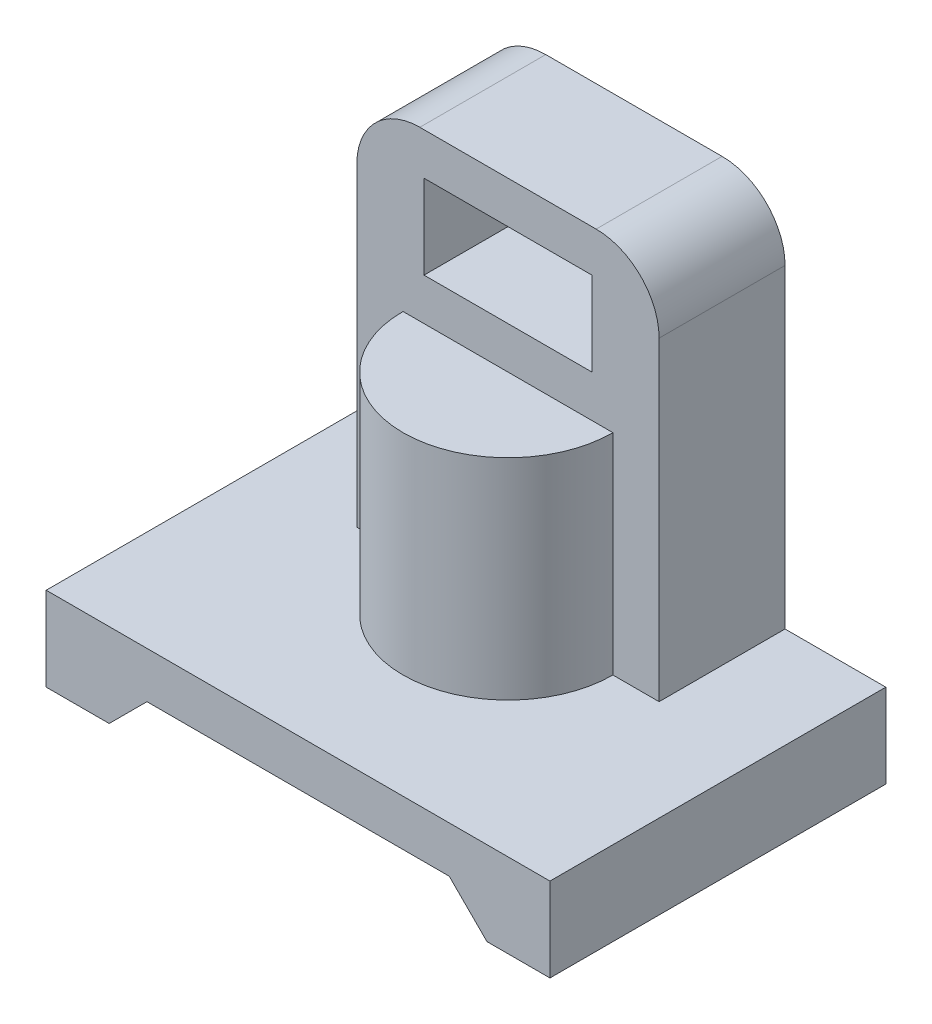
ISO-10303-21;
HEADER;
FILE_DESCRIPTION(('STEP AP214'),'2;1');
FILE_NAME('part.step','',(''),(''),'','','');
FILE_SCHEMA(('AUTOMOTIVE_DESIGN { 1 0 10303 214 1 1 1 1 }'));
ENDSEC;
DATA;
#1=APPLICATION_CONTEXT('core data for automotive mechanical design processes');
#2=APPLICATION_PROTOCOL_DEFINITION('international standard','automotive_design',2000,#1);
#3=PRODUCT_CONTEXT('',#1,'mechanical');
#4=PRODUCT('Part','Part','',(#3));
#5=PRODUCT_RELATED_PRODUCT_CATEGORY('part','',(#4));
#6=PRODUCT_DEFINITION_FORMATION('','',#4);
#7=PRODUCT_DEFINITION_CONTEXT('part definition',#1,'design');
#8=PRODUCT_DEFINITION('design','',#6,#7);
#9=PRODUCT_DEFINITION_SHAPE('','',#8);
#10=(LENGTH_UNIT() NAMED_UNIT(*) SI_UNIT(.MILLI.,.METRE.));
#11=(NAMED_UNIT(*) PLANE_ANGLE_UNIT() SI_UNIT($,.RADIAN.));
#12=(NAMED_UNIT(*) SI_UNIT($,.STERADIAN.) SOLID_ANGLE_UNIT());
#13=UNCERTAINTY_MEASURE_WITH_UNIT(LENGTH_MEASURE(1.E-05),#10,'distance_accuracy_value','');
#14=(GEOMETRIC_REPRESENTATION_CONTEXT(3) GLOBAL_UNCERTAINTY_ASSIGNED_CONTEXT((#13)) GLOBAL_UNIT_ASSIGNED_CONTEXT((#10,
#11,#12)) REPRESENTATION_CONTEXT('',''));
#15=CARTESIAN_POINT('',(0.,0.,0.));
#16=DIRECTION('',(0.,0.,1.));
#17=DIRECTION('',(1.,0.,0.));
#18=AXIS2_PLACEMENT_3D('',#15,#16,#17);
#19=CARTESIAN_POINT('',(0.,110.,30.));
#20=DIRECTION('',(0.,0.,-1.));
#21=DIRECTION('',(-1.,0.,0.));
#22=AXIS2_PLACEMENT_3D('',#19,#20,#21);
#23=PLANE('',#22);
#24=DIRECTION('',(1.,0.,0.));
#25=VECTOR('',#24,1.);
#26=CARTESIAN_POINT('',(0.,100.,30.));
#27=LINE('',#26,#25);
#28=CARTESIAN_POINT('',(40.,100.,30.));
#29=VERTEX_POINT('',#28);
#30=CARTESIAN_POINT('',(80.,100.,30.));
#31=VERTEX_POINT('',#30);
#32=EDGE_CURVE('E262',#29,#31,#27,.T.);
#33=ORIENTED_EDGE('',*,*,#32,.T.);
#34=DIRECTION('',(0.,-1.,0.));
#35=VECTOR('',#34,1.);
#36=CARTESIAN_POINT('',(80.,110.,30.));
#37=LINE('',#36,#35);
#38=CARTESIAN_POINT('',(80.,80.,30.));
#39=VERTEX_POINT('',#38);
#40=EDGE_CURVE('E243',#31,#39,#37,.T.);
#41=ORIENTED_EDGE('',*,*,#40,.T.);
#42=DIRECTION('',(-1.,0.,0.));
#43=VECTOR('',#42,1.);
#44=CARTESIAN_POINT('',(0.,80.,30.));
#45=LINE('',#44,#43);
#46=CARTESIAN_POINT('',(40.,80.,30.));
#47=VERTEX_POINT('',#46);
#48=EDGE_CURVE('E271',#39,#47,#45,.T.);
#49=ORIENTED_EDGE('',*,*,#48,.T.);
#50=DIRECTION('',(0.,1.,0.));
#51=VECTOR('',#50,1.);
#52=CARTESIAN_POINT('',(40.,110.,30.));
#53=LINE('',#52,#51);
#54=EDGE_CURVE('E268',#47,#29,#53,.T.);
#55=ORIENTED_EDGE('',*,*,#54,.T.);
#56=EDGE_LOOP('',(#33,#41,#49,#55));
#57=FACE_BOUND('',#56,.T.);
#58=DIRECTION('',(0.,-1.,0.));
#59=VECTOR('',#58,1.);
#60=CARTESIAN_POINT('',(96.,110.,30.));
#61=LINE('',#60,#59);
#62=CARTESIAN_POINT('',(96.,95.,30.));
#63=VERTEX_POINT('',#62);
#64=CARTESIAN_POINT('',(96.,20.,30.));
#65=VERTEX_POINT('',#64);
#66=EDGE_CURVE('E301',#63,#65,#61,.T.);
#67=ORIENTED_EDGE('',*,*,#66,.F.);
#68=CARTESIAN_POINT('',(81.,95.,30.));
#69=DIRECTION('',(0.,0.,-1.));
#70=DIRECTION('',(-1.,0.,0.));
#71=AXIS2_PLACEMENT_3D('',#68,#69,#70);
#72=CIRCLE('',#71,15.);
#73=CARTESIAN_POINT('',(81.,110.,30.));
#74=VERTEX_POINT('',#73);
#75=EDGE_CURVE('E109',#63,#74,#72,.F.);
#76=ORIENTED_EDGE('',*,*,#75,.T.);
#77=DIRECTION('',(1.,0.,0.));
#78=VECTOR('',#77,1.);
#79=CARTESIAN_POINT('',(0.,110.,30.));
#80=LINE('',#79,#78);
#81=CARTESIAN_POINT('',(39.,110.,30.));
#82=VERTEX_POINT('',#81);
#83=EDGE_CURVE('E292',#82,#74,#80,.T.);
#84=ORIENTED_EDGE('',*,*,#83,.F.);
#85=CARTESIAN_POINT('',(39.,95.,30.));
#86=DIRECTION('',(0.,0.,-1.));
#87=DIRECTION('',(-1.,0.,0.));
#88=AXIS2_PLACEMENT_3D('',#85,#86,#87);
#89=CIRCLE('',#88,15.);
#90=CARTESIAN_POINT('',(24.,95.,30.));
#91=VERTEX_POINT('',#90);
#92=EDGE_CURVE('E387',#82,#91,#89,.F.);
#93=ORIENTED_EDGE('',*,*,#92,.T.);
#94=DIRECTION('',(0.,-1.,0.));
#95=VECTOR('',#94,1.);
#96=CARTESIAN_POINT('',(24.,110.,30.));
#97=LINE('',#96,#95);
#98=CARTESIAN_POINT('',(24.,20.,30.));
#99=VERTEX_POINT('',#98);
#100=EDGE_CURVE('E296',#91,#99,#97,.T.);
#101=ORIENTED_EDGE('',*,*,#100,.T.);
#102=DIRECTION('',(1.,0.,0.));
#103=VECTOR('',#102,1.);
#104=CARTESIAN_POINT('',(0.,20.,30.));
#105=LINE('',#104,#103);
#106=CARTESIAN_POINT('',(35.,20.,30.));
#107=VERTEX_POINT('',#106);
#108=EDGE_CURVE('E293',#99,#107,#105,.T.);
#109=ORIENTED_EDGE('',*,*,#108,.T.);
#110=DIRECTION('',(0.,-1.,0.));
#111=VECTOR('',#110,1.);
#112=CARTESIAN_POINT('',(35.,70.,30.));
#113=LINE('',#112,#111);
#114=CARTESIAN_POINT('',(35.,70.,30.));
#115=VERTEX_POINT('',#114);
#116=EDGE_CURVE('E286',#115,#107,#113,.T.);
#117=ORIENTED_EDGE('',*,*,#116,.F.);
#118=DIRECTION('',(1.,0.,0.));
#119=VECTOR('',#118,1.);
#120=CARTESIAN_POINT('',(0.,70.,30.));
#121=LINE('',#120,#119);
#122=CARTESIAN_POINT('',(85.,70.,30.));
#123=VERTEX_POINT('',#122);
#124=EDGE_CURVE('E276',#115,#123,#121,.T.);
#125=ORIENTED_EDGE('',*,*,#124,.T.);
#126=DIRECTION('',(0.,-1.,0.));
#127=VECTOR('',#126,1.);
#128=CARTESIAN_POINT('',(85.,70.,30.));
#129=LINE('',#128,#127);
#130=CARTESIAN_POINT('',(85.,20.,30.));
#131=VERTEX_POINT('',#130);
#132=EDGE_CURVE('E282',#123,#131,#129,.T.);
#133=ORIENTED_EDGE('',*,*,#132,.T.);
#134=EDGE_CURVE('E300',#131,#65,#105,.T.);
#135=ORIENTED_EDGE('',*,*,#134,.T.);
#136=EDGE_LOOP('',(#67,#76,#84,#93,#101,#109,#117,#125,#133,#135));
#137=FACE_BOUND('',#136,.T.);
#138=ADVANCED_FACE('F101',(#57,#137),#23,.F.);
#139=CARTESIAN_POINT('',(0.,0.,0.));
#140=DIRECTION('',(0.,1.,0.));
#141=DIRECTION('',(0.,0.,1.));
#142=AXIS2_PLACEMENT_3D('',#139,#140,#141);
#143=PLANE('',#142);
#144=DIRECTION('',(-1.,0.,0.));
#145=VECTOR('',#144,1.);
#146=CARTESIAN_POINT('',(120.,0.,0.));
#147=LINE('',#146,#145);
#148=CARTESIAN_POINT('',(15.,0.,0.));
#149=VERTEX_POINT('',#148);
#150=CARTESIAN_POINT('',(0.,0.,0.));
#151=VERTEX_POINT('',#150);
#152=EDGE_CURVE('E338',#149,#151,#147,.T.);
#153=ORIENTED_EDGE('',*,*,#152,.F.);
#154=DIRECTION('',(0.,0.,1.));
#155=VECTOR('',#154,1.);
#156=CARTESIAN_POINT('',(15.,0.,0.));
#157=LINE('',#156,#155);
#158=CARTESIAN_POINT('',(15.,0.,80.));
#159=VERTEX_POINT('',#158);
#160=EDGE_CURVE('E322',#149,#159,#157,.T.);
#161=ORIENTED_EDGE('',*,*,#160,.T.);
#162=DIRECTION('',(1.,0.,0.));
#163=VECTOR('',#162,1.);
#164=CARTESIAN_POINT('',(0.,0.,80.));
#165=LINE('',#164,#163);
#166=CARTESIAN_POINT('',(0.,0.,80.));
#167=VERTEX_POINT('',#166);
#168=EDGE_CURVE('E356',#167,#159,#165,.T.);
#169=ORIENTED_EDGE('',*,*,#168,.F.);
#170=DIRECTION('',(0.,0.,1.));
#171=VECTOR('',#170,1.);
#172=CARTESIAN_POINT('',(0.,0.,0.));
#173=LINE('',#172,#171);
#174=EDGE_CURVE('E353',#151,#167,#173,.T.);
#175=ORIENTED_EDGE('',*,*,#174,.F.);
#176=EDGE_LOOP('',(#153,#161,#169,#175));
#177=FACE_BOUND('',#176,.T.);
#178=ADVANCED_FACE('F434',(#177),#143,.F.);
#179=CARTESIAN_POINT('',(120.,20.,0.));
#180=DIRECTION('',(0.,0.,1.));
#181=DIRECTION('',(1.,0.,0.));
#182=AXIS2_PLACEMENT_3D('',#179,#180,#181);
#183=PLANE('',#182);
#184=DIRECTION('',(1.,0.,0.));
#185=VECTOR('',#184,1.);
#186=CARTESIAN_POINT('',(80.,80.,0.));
#187=LINE('',#186,#185);
#188=CARTESIAN_POINT('',(40.,80.,0.));
#189=VERTEX_POINT('',#188);
#190=CARTESIAN_POINT('',(80.,80.,0.));
#191=VERTEX_POINT('',#190);
#192=EDGE_CURVE('E246',#189,#191,#187,.T.);
#193=ORIENTED_EDGE('',*,*,#192,.T.);
#194=DIRECTION('',(0.,1.,0.));
#195=VECTOR('',#194,1.);
#196=CARTESIAN_POINT('',(80.,100.,0.));
#197=LINE('',#196,#195);
#198=CARTESIAN_POINT('',(80.,100.,0.));
#199=VERTEX_POINT('',#198);
#200=EDGE_CURVE('E240',#191,#199,#197,.T.);
#201=ORIENTED_EDGE('',*,*,#200,.T.);
#202=DIRECTION('',(-1.,0.,0.));
#203=VECTOR('',#202,1.);
#204=CARTESIAN_POINT('',(40.,100.,0.));
#205=LINE('',#204,#203);
#206=CARTESIAN_POINT('',(40.,100.,0.));
#207=VERTEX_POINT('',#206);
#208=EDGE_CURVE('E249',#199,#207,#205,.T.);
#209=ORIENTED_EDGE('',*,*,#208,.T.);
#210=DIRECTION('',(0.,-1.,0.));
#211=VECTOR('',#210,1.);
#212=CARTESIAN_POINT('',(40.,100.,0.));
#213=LINE('',#212,#211);
#214=EDGE_CURVE('E124',#207,#189,#213,.T.);
#215=ORIENTED_EDGE('',*,*,#214,.T.);
#216=EDGE_LOOP('',(#193,#201,#209,#215));
#217=FACE_BOUND('',#216,.T.);
#218=DIRECTION('',(-1.,0.,0.));
#219=VECTOR('',#218,1.);
#220=CARTESIAN_POINT('',(0.,110.,0.));
#221=LINE('',#220,#219);
#222=CARTESIAN_POINT('',(81.,110.,0.));
#223=VERTEX_POINT('',#222);
#224=CARTESIAN_POINT('',(39.,110.,0.));
#225=VERTEX_POINT('',#224);
#226=EDGE_CURVE('E289',#223,#225,#221,.T.);
#227=ORIENTED_EDGE('',*,*,#226,.F.);
#228=CARTESIAN_POINT('',(81.,95.,0.));
#229=DIRECTION('',(0.,0.,1.));
#230=DIRECTION('',(1.,0.,0.));
#231=AXIS2_PLACEMENT_3D('',#228,#229,#230);
#232=CIRCLE('',#231,15.);
#233=CARTESIAN_POINT('',(96.,95.,0.));
#234=VERTEX_POINT('',#233);
#235=EDGE_CURVE('E383',#223,#234,#232,.F.);
#236=ORIENTED_EDGE('',*,*,#235,.T.);
#237=DIRECTION('',(0.,-1.,0.));
#238=VECTOR('',#237,1.);
#239=CARTESIAN_POINT('',(96.,110.,0.));
#240=LINE('',#239,#238);
#241=CARTESIAN_POINT('',(96.,20.,0.));
#242=VERTEX_POINT('',#241);
#243=EDGE_CURVE('E310',#234,#242,#240,.T.);
#244=ORIENTED_EDGE('',*,*,#243,.T.);
#245=DIRECTION('',(-1.,0.,0.));
#246=VECTOR('',#245,1.);
#247=CARTESIAN_POINT('',(120.,20.,0.));
#248=LINE('',#247,#246);
#249=CARTESIAN_POINT('',(120.,20.,0.));
#250=VERTEX_POINT('',#249);
#251=EDGE_CURVE('E339',#250,#242,#248,.T.);
#252=ORIENTED_EDGE('',*,*,#251,.F.);
#253=DIRECTION('',(0.,-1.,0.));
#254=VECTOR('',#253,1.);
#255=CARTESIAN_POINT('',(120.,20.,0.));
#256=LINE('',#255,#254);
#257=CARTESIAN_POINT('',(120.,0.,0.));
#258=VERTEX_POINT('',#257);
#259=EDGE_CURVE('E349',#250,#258,#256,.T.);
#260=ORIENTED_EDGE('',*,*,#259,.T.);
#261=CARTESIAN_POINT('',(105.,0.,0.));
#262=VERTEX_POINT('',#261);
#263=EDGE_CURVE('E350',#258,#262,#147,.T.);
#264=ORIENTED_EDGE('',*,*,#263,.T.);
#265=DIRECTION('',(-0.707106781186551,0.707106781186544,0.));
#266=VECTOR('',#265,1.);
#267=CARTESIAN_POINT('',(105.,0.,0.));
#268=LINE('',#267,#266);
#269=CARTESIAN_POINT('',(95.9999999999999,9.00000000000001,0.));
#270=VERTEX_POINT('',#269);
#271=EDGE_CURVE('E307',#262,#270,#268,.T.);
#272=ORIENTED_EDGE('',*,*,#271,.T.);
#273=DIRECTION('',(-1.,0.,0.));
#274=VECTOR('',#273,1.);
#275=CARTESIAN_POINT('',(95.9999999999999,9.00000000000001,0.));
#276=LINE('',#275,#274);
#277=CARTESIAN_POINT('',(24.0000000000001,9.,0.));
#278=VERTEX_POINT('',#277);
#279=EDGE_CURVE('E315',#270,#278,#276,.T.);
#280=ORIENTED_EDGE('',*,*,#279,.T.);
#281=DIRECTION('',(-0.707106781186551,-0.707106781186544,0.));
#282=VECTOR('',#281,1.);
#283=CARTESIAN_POINT('',(24.0000000000001,9.,0.));
#284=LINE('',#283,#282);
#285=EDGE_CURVE('E318',#278,#149,#284,.T.);
#286=ORIENTED_EDGE('',*,*,#285,.T.);
#287=ORIENTED_EDGE('',*,*,#152,.T.);
#288=DIRECTION('',(0.,-1.,0.));
#289=VECTOR('',#288,1.);
#290=CARTESIAN_POINT('',(0.,20.,0.));
#291=LINE('',#290,#289);
#292=CARTESIAN_POINT('',(0.,20.,0.));
#293=VERTEX_POINT('',#292);
#294=EDGE_CURVE('E369',#293,#151,#291,.T.);
#295=ORIENTED_EDGE('',*,*,#294,.F.);
#296=CARTESIAN_POINT('',(24.,20.,0.));
#297=VERTEX_POINT('',#296);
#298=EDGE_CURVE('E343',#297,#293,#248,.T.);
#299=ORIENTED_EDGE('',*,*,#298,.F.);
#300=DIRECTION('',(0.,-1.,0.));
#301=VECTOR('',#300,1.);
#302=CARTESIAN_POINT('',(24.,110.,0.));
#303=LINE('',#302,#301);
#304=CARTESIAN_POINT('',(24.,95.,0.));
#305=VERTEX_POINT('',#304);
#306=EDGE_CURVE('E305',#305,#297,#303,.T.);
#307=ORIENTED_EDGE('',*,*,#306,.F.);
#308=CARTESIAN_POINT('',(39.,95.,0.));
#309=DIRECTION('',(0.,0.,1.));
#310=DIRECTION('',(1.,0.,0.));
#311=AXIS2_PLACEMENT_3D('',#308,#309,#310);
#312=CIRCLE('',#311,15.);
#313=EDGE_CURVE('E381',#305,#225,#312,.F.);
#314=ORIENTED_EDGE('',*,*,#313,.T.);
#315=EDGE_LOOP('',(#227,#236,#244,#252,#260,#264,#272,#280,#286,#287,#295,#299,#307,#314));
#316=FACE_BOUND('',#315,.T.);
#317=ADVANCED_FACE('F253',(#217,#316),#183,.F.);
#318=CARTESIAN_POINT('',(0.,20.,0.));
#319=DIRECTION('',(1.,0.,0.));
#320=DIRECTION('',(0.,0.,-1.));
#321=AXIS2_PLACEMENT_3D('',#318,#319,#320);
#322=PLANE('',#321);
#323=ORIENTED_EDGE('',*,*,#174,.T.);
#324=DIRECTION('',(0.,-1.,0.));
#325=VECTOR('',#324,1.);
#326=CARTESIAN_POINT('',(0.,20.,80.));
#327=LINE('',#326,#325);
#328=CARTESIAN_POINT('',(0.,20.,80.));
#329=VERTEX_POINT('',#328);
#330=EDGE_CURVE('E366',#329,#167,#327,.T.);
#331=ORIENTED_EDGE('',*,*,#330,.F.);
#332=DIRECTION('',(0.,0.,1.));
#333=VECTOR('',#332,1.);
#334=CARTESIAN_POINT('',(0.,20.,0.));
#335=LINE('',#334,#333);
#336=EDGE_CURVE('E342',#293,#329,#335,.T.);
#337=ORIENTED_EDGE('',*,*,#336,.F.);
#338=ORIENTED_EDGE('',*,*,#294,.T.);
#339=EDGE_LOOP('',(#323,#331,#337,#338));
#340=FACE_BOUND('',#339,.T.);
#341=ADVANCED_FACE('F439',(#340),#322,.F.);
#342=CARTESIAN_POINT('',(0.,20.,80.));
#343=DIRECTION('',(0.,0.,-1.));
#344=DIRECTION('',(-1.,0.,0.));
#345=AXIS2_PLACEMENT_3D('',#342,#343,#344);
#346=PLANE('',#345);
#347=ORIENTED_EDGE('',*,*,#168,.T.);
#348=DIRECTION('',(0.707106781186551,0.707106781186544,0.));
#349=VECTOR('',#348,1.);
#350=CARTESIAN_POINT('',(17.4999999999999,2.4999999999999,80.));
#351=LINE('',#350,#349);
#352=CARTESIAN_POINT('',(24.0000000000001,9.,80.));
#353=VERTEX_POINT('',#352);
#354=EDGE_CURVE('E335',#159,#353,#351,.T.);
#355=ORIENTED_EDGE('',*,*,#354,.T.);
#356=DIRECTION('',(1.,0.,0.));
#357=VECTOR('',#356,1.);
#358=CARTESIAN_POINT('',(0.,9.,80.));
#359=LINE('',#358,#357);
#360=CARTESIAN_POINT('',(95.9999999999999,9.00000000000001,80.));
#361=VERTEX_POINT('',#360);
#362=EDGE_CURVE('E372',#353,#361,#359,.T.);
#363=ORIENTED_EDGE('',*,*,#362,.T.);
#364=DIRECTION('',(0.707106781186551,-0.707106781186544,0.));
#365=VECTOR('',#364,1.);
#366=CARTESIAN_POINT('',(42.4999999999994,62.4999999999999,80.));
#367=LINE('',#366,#365);
#368=CARTESIAN_POINT('',(105.,0.,80.));
#369=VERTEX_POINT('',#368);
#370=EDGE_CURVE('E325',#361,#369,#367,.T.);
#371=ORIENTED_EDGE('',*,*,#370,.T.);
#372=CARTESIAN_POINT('',(120.,0.,80.));
#373=VERTEX_POINT('',#372);
#374=EDGE_CURVE('E355',#369,#373,#165,.T.);
#375=ORIENTED_EDGE('',*,*,#374,.T.);
#376=DIRECTION('',(0.,-1.,0.));
#377=VECTOR('',#376,1.);
#378=CARTESIAN_POINT('',(120.,20.,80.));
#379=LINE('',#378,#377);
#380=CARTESIAN_POINT('',(120.,20.,80.));
#381=VERTEX_POINT('',#380);
#382=EDGE_CURVE('E363',#381,#373,#379,.T.);
#383=ORIENTED_EDGE('',*,*,#382,.F.);
#384=DIRECTION('',(1.,0.,0.));
#385=VECTOR('',#384,1.);
#386=CARTESIAN_POINT('',(0.,20.,80.));
#387=LINE('',#386,#385);
#388=EDGE_CURVE('E345',#329,#381,#387,.T.);
#389=ORIENTED_EDGE('',*,*,#388,.F.);
#390=ORIENTED_EDGE('',*,*,#330,.T.);
#391=EDGE_LOOP('',(#347,#355,#363,#371,#375,#383,#389,#390));
#392=FACE_BOUND('',#391,.T.);
#393=ADVANCED_FACE('F422',(#392),#346,.F.);
#394=CARTESIAN_POINT('',(120.,20.,80.));
#395=DIRECTION('',(-1.,0.,0.));
#396=DIRECTION('',(0.,0.,1.));
#397=AXIS2_PLACEMENT_3D('',#394,#395,#396);
#398=PLANE('',#397);
#399=DIRECTION('',(0.,0.,-1.));
#400=VECTOR('',#399,1.);
#401=CARTESIAN_POINT('',(120.,0.,80.));
#402=LINE('',#401,#400);
#403=EDGE_CURVE('E359',#373,#258,#402,.T.);
#404=ORIENTED_EDGE('',*,*,#403,.T.);
#405=ORIENTED_EDGE('',*,*,#259,.F.);
#406=DIRECTION('',(0.,0.,-1.));
#407=VECTOR('',#406,1.);
#408=CARTESIAN_POINT('',(120.,20.,80.));
#409=LINE('',#408,#407);
#410=EDGE_CURVE('E347',#381,#250,#409,.T.);
#411=ORIENTED_EDGE('',*,*,#410,.F.);
#412=ORIENTED_EDGE('',*,*,#382,.T.);
#413=EDGE_LOOP('',(#404,#405,#411,#412));
#414=FACE_BOUND('',#413,.T.);
#415=ADVANCED_FACE('F486',(#414),#398,.F.);
#416=CARTESIAN_POINT('',(0.,20.,0.));
#417=DIRECTION('',(0.,1.,0.));
#418=DIRECTION('',(0.,0.,1.));
#419=AXIS2_PLACEMENT_3D('',#416,#417,#418);
#420=PLANE('',#419);
#421=ORIENTED_EDGE('',*,*,#134,.F.);
#422=CARTESIAN_POINT('',(60.,20.,30.));
#423=DIRECTION('',(0.,1.,0.));
#424=DIRECTION('',(0.,0.,1.));
#425=AXIS2_PLACEMENT_3D('',#422,#423,#424);
#426=CIRCLE('',#425,25.);
#427=EDGE_CURVE('E275',#107,#131,#426,.T.);
#428=ORIENTED_EDGE('',*,*,#427,.F.);
#429=ORIENTED_EDGE('',*,*,#108,.F.);
#430=DIRECTION('',(0.,0.,1.));
#431=VECTOR('',#430,1.);
#432=CARTESIAN_POINT('',(24.,20.,0.));
#433=LINE('',#432,#431);
#434=EDGE_CURVE('E297',#297,#99,#433,.T.);
#435=ORIENTED_EDGE('',*,*,#434,.F.);
#436=ORIENTED_EDGE('',*,*,#298,.T.);
#437=ORIENTED_EDGE('',*,*,#336,.T.);
#438=ORIENTED_EDGE('',*,*,#388,.T.);
#439=ORIENTED_EDGE('',*,*,#410,.T.);
#440=ORIENTED_EDGE('',*,*,#251,.T.);
#441=DIRECTION('',(0.,0.,-1.));
#442=VECTOR('',#441,1.);
#443=CARTESIAN_POINT('',(96.,20.,0.));
#444=LINE('',#443,#442);
#445=EDGE_CURVE('E288',#65,#242,#444,.T.);
#446=ORIENTED_EDGE('',*,*,#445,.F.);
#447=EDGE_LOOP('',(#421,#428,#429,#435,#436,#437,#438,#439,#440,#446));
#448=FACE_BOUND('',#447,.T.);
#449=ADVANCED_FACE('F408',(#448),#420,.T.);
#450=ORIENTED_EDGE('',*,*,#374,.F.);
#451=DIRECTION('',(0.,0.,1.));
#452=VECTOR('',#451,1.);
#453=CARTESIAN_POINT('',(105.,0.,0.));
#454=LINE('',#453,#452);
#455=EDGE_CURVE('E321',#262,#369,#454,.T.);
#456=ORIENTED_EDGE('',*,*,#455,.F.);
#457=ORIENTED_EDGE('',*,*,#263,.F.);
#458=ORIENTED_EDGE('',*,*,#403,.F.);
#459=EDGE_LOOP('',(#450,#456,#457,#458));
#460=FACE_BOUND('',#459,.T.);
#461=ADVANCED_FACE('F418',(#460),#143,.F.);
#462=CARTESIAN_POINT('',(57.0057845188528,9.,0.));
#463=DIRECTION('',(0.,1.,0.));
#464=DIRECTION('',(0.,0.,1.));
#465=AXIS2_PLACEMENT_3D('',#462,#463,#464);
#466=PLANE('',#465);
#467=DIRECTION('',(0.,0.,1.));
#468=VECTOR('',#467,1.);
#469=CARTESIAN_POINT('',(24.0000000000001,9.,0.));
#470=LINE('',#469,#468);
#471=EDGE_CURVE('E326',#278,#353,#470,.T.);
#472=ORIENTED_EDGE('',*,*,#471,.F.);
#473=ORIENTED_EDGE('',*,*,#279,.F.);
#474=DIRECTION('',(0.,0.,1.));
#475=VECTOR('',#474,1.);
#476=CARTESIAN_POINT('',(95.9999999999999,9.00000000000001,0.));
#477=LINE('',#476,#475);
#478=EDGE_CURVE('E329',#270,#361,#477,.T.);
#479=ORIENTED_EDGE('',*,*,#478,.T.);
#480=ORIENTED_EDGE('',*,*,#362,.F.);
#481=EDGE_LOOP('',(#472,#473,#479,#480));
#482=FACE_BOUND('',#481,.T.);
#483=ADVANCED_FACE('F425',(#482),#466,.F.);
#484=CARTESIAN_POINT('',(24.0000000000001,9.,0.));
#485=DIRECTION('',(-0.707106781186544,0.707106781186551,0.));
#486=DIRECTION('',(-0.707106781186551,-0.707106781186544,0.));
#487=AXIS2_PLACEMENT_3D('',#484,#485,#486);
#488=PLANE('',#487);
#489=ORIENTED_EDGE('',*,*,#160,.F.);
#490=ORIENTED_EDGE('',*,*,#285,.F.);
#491=ORIENTED_EDGE('',*,*,#471,.T.);
#492=ORIENTED_EDGE('',*,*,#354,.F.);
#493=EDGE_LOOP('',(#489,#490,#491,#492));
#494=FACE_BOUND('',#493,.T.);
#495=ADVANCED_FACE('F429',(#494),#488,.F.);
#496=CARTESIAN_POINT('',(105.,0.,0.));
#497=DIRECTION('',(0.707106781186544,0.707106781186551,0.));
#498=DIRECTION('',(-0.707106781186551,0.707106781186544,0.));
#499=AXIS2_PLACEMENT_3D('',#496,#497,#498);
#500=PLANE('',#499);
#501=ORIENTED_EDGE('',*,*,#478,.F.);
#502=ORIENTED_EDGE('',*,*,#271,.F.);
#503=ORIENTED_EDGE('',*,*,#455,.T.);
#504=ORIENTED_EDGE('',*,*,#370,.F.);
#505=EDGE_LOOP('',(#501,#502,#503,#504));
#506=FACE_BOUND('',#505,.T.);
#507=ADVANCED_FACE('F420',(#506),#500,.F.);
#508=CARTESIAN_POINT('',(24.,110.,0.));
#509=DIRECTION('',(1.,0.,0.));
#510=DIRECTION('',(0.,0.,-1.));
#511=AXIS2_PLACEMENT_3D('',#508,#509,#510);
#512=PLANE('',#511);
#513=ORIENTED_EDGE('',*,*,#100,.F.);
#514=DIRECTION('',(0.,0.,1.));
#515=VECTOR('',#514,1.);
#516=CARTESIAN_POINT('',(24.,95.,0.));
#517=LINE('',#516,#515);
#518=EDGE_CURVE('E12',#91,#305,#517,.F.);
#519=ORIENTED_EDGE('',*,*,#518,.T.);
#520=ORIENTED_EDGE('',*,*,#306,.T.);
#521=ORIENTED_EDGE('',*,*,#434,.T.);
#522=EDGE_LOOP('',(#513,#519,#520,#521));
#523=FACE_BOUND('',#522,.T.);
#524=ADVANCED_FACE('F447',(#523),#512,.F.);
#525=CARTESIAN_POINT('',(0.,110.,0.));
#526=DIRECTION('',(0.,1.,0.));
#527=DIRECTION('',(0.,0.,1.));
#528=AXIS2_PLACEMENT_3D('',#525,#526,#527);
#529=PLANE('',#528);
#530=ORIENTED_EDGE('',*,*,#83,.T.);
#531=DIRECTION('',(0.,0.,-1.));
#532=VECTOR('',#531,1.);
#533=CARTESIAN_POINT('',(81.,110.,0.));
#534=LINE('',#533,#532);
#535=EDGE_CURVE('E378',#74,#223,#534,.T.);
#536=ORIENTED_EDGE('',*,*,#535,.T.);
#537=ORIENTED_EDGE('',*,*,#226,.T.);
#538=DIRECTION('',(0.,0.,1.));
#539=VECTOR('',#538,1.);
#540=CARTESIAN_POINT('',(39.,110.,30.));
#541=LINE('',#540,#539);
#542=EDGE_CURVE('E375',#225,#82,#541,.T.);
#543=ORIENTED_EDGE('',*,*,#542,.T.);
#544=EDGE_LOOP('',(#530,#536,#537,#543));
#545=FACE_BOUND('',#544,.T.);
#546=ADVANCED_FACE('F397',(#545),#529,.T.);
#547=CARTESIAN_POINT('',(96.,110.,0.));
#548=DIRECTION('',(-1.,0.,0.));
#549=DIRECTION('',(0.,0.,1.));
#550=AXIS2_PLACEMENT_3D('',#547,#548,#549);
#551=PLANE('',#550);
#552=ORIENTED_EDGE('',*,*,#243,.F.);
#553=DIRECTION('',(0.,0.,-1.));
#554=VECTOR('',#553,1.);
#555=CARTESIAN_POINT('',(96.,95.,30.));
#556=LINE('',#555,#554);
#557=EDGE_CURVE('E385',#234,#63,#556,.F.);
#558=ORIENTED_EDGE('',*,*,#557,.T.);
#559=ORIENTED_EDGE('',*,*,#66,.T.);
#560=ORIENTED_EDGE('',*,*,#445,.T.);
#561=EDGE_LOOP('',(#552,#558,#559,#560));
#562=FACE_BOUND('',#561,.T.);
#563=ADVANCED_FACE('F404',(#562),#551,.F.);
#564=CARTESIAN_POINT('',(60.,70.,30.));
#565=DIRECTION('',(0.,-1.,0.));
#566=DIRECTION('',(0.,0.,-1.));
#567=AXIS2_PLACEMENT_3D('',#564,#565,#566);
#568=CYLINDRICAL_SURFACE('',#567,25.);
#569=ORIENTED_EDGE('',*,*,#427,.T.);
#570=ORIENTED_EDGE('',*,*,#132,.F.);
#571=CARTESIAN_POINT('',(60.,70.,30.));
#572=DIRECTION('',(0.,1.,0.));
#573=DIRECTION('',(0.,0.,1.));
#574=AXIS2_PLACEMENT_3D('',#571,#572,#573);
#575=CIRCLE('',#574,25.);
#576=EDGE_CURVE('E279',#115,#123,#575,.T.);
#577=ORIENTED_EDGE('',*,*,#576,.F.);
#578=ORIENTED_EDGE('',*,*,#116,.T.);
#579=EDGE_LOOP('',(#569,#570,#577,#578));
#580=FACE_BOUND('',#579,.T.);
#581=ADVANCED_FACE('F453',(#580),#568,.T.);
#582=CARTESIAN_POINT('',(0.,70.,0.));
#583=DIRECTION('',(0.,1.,0.));
#584=DIRECTION('',(0.,0.,1.));
#585=AXIS2_PLACEMENT_3D('',#582,#583,#584);
#586=PLANE('',#585);
#587=ORIENTED_EDGE('',*,*,#124,.F.);
#588=ORIENTED_EDGE('',*,*,#576,.T.);
#589=EDGE_LOOP('',(#587,#588));
#590=FACE_BOUND('',#589,.T.);
#591=ADVANCED_FACE('F455',(#590),#586,.T.);
#592=CARTESIAN_POINT('',(81.,95.,0.));
#593=DIRECTION('',(0.,0.,1.));
#594=DIRECTION('',(1.,0.,0.));
#595=AXIS2_PLACEMENT_3D('',#592,#593,#594);
#596=CYLINDRICAL_SURFACE('',#595,15.);
#597=ORIENTED_EDGE('',*,*,#75,.F.);
#598=ORIENTED_EDGE('',*,*,#557,.F.);
#599=ORIENTED_EDGE('',*,*,#235,.F.);
#600=ORIENTED_EDGE('',*,*,#535,.F.);
#601=EDGE_LOOP('',(#597,#598,#599,#600));
#602=FACE_BOUND('',#601,.T.);
#603=ADVANCED_FACE('F400',(#602),#596,.T.);
#604=CARTESIAN_POINT('',(39.,95.,0.));
#605=DIRECTION('',(0.,0.,-1.));
#606=DIRECTION('',(-1.,0.,0.));
#607=AXIS2_PLACEMENT_3D('',#604,#605,#606);
#608=CYLINDRICAL_SURFACE('',#607,15.);
#609=ORIENTED_EDGE('',*,*,#313,.F.);
#610=ORIENTED_EDGE('',*,*,#518,.F.);
#611=ORIENTED_EDGE('',*,*,#92,.F.);
#612=ORIENTED_EDGE('',*,*,#542,.F.);
#613=EDGE_LOOP('',(#609,#610,#611,#612));
#614=FACE_BOUND('',#613,.T.);
#615=ADVANCED_FACE('F103',(#614),#608,.T.);
#616=CARTESIAN_POINT('',(80.,100.,0.));
#617=DIRECTION('',(1.,0.,0.));
#618=DIRECTION('',(0.,1.,0.));
#619=AXIS2_PLACEMENT_3D('',#616,#617,#618);
#620=PLANE('',#619);
#621=DIRECTION('',(0.,0.,1.));
#622=VECTOR('',#621,1.);
#623=CARTESIAN_POINT('',(80.,100.,0.));
#624=LINE('',#623,#622);
#625=EDGE_CURVE('E116',#199,#31,#624,.T.);
#626=ORIENTED_EDGE('',*,*,#625,.F.);
#627=ORIENTED_EDGE('',*,*,#200,.F.);
#628=DIRECTION('',(0.,0.,1.));
#629=VECTOR('',#628,1.);
#630=CARTESIAN_POINT('',(80.,80.,0.));
#631=LINE('',#630,#629);
#632=EDGE_CURVE('E260',#191,#39,#631,.T.);
#633=ORIENTED_EDGE('',*,*,#632,.T.);
#634=ORIENTED_EDGE('',*,*,#40,.F.);
#635=EDGE_LOOP('',(#626,#627,#633,#634));
#636=FACE_BOUND('',#635,.T.);
#637=ADVANCED_FACE('F237',(#636),#620,.F.);
#638=CARTESIAN_POINT('',(80.,80.,0.));
#639=DIRECTION('',(0.,-1.,0.));
#640=DIRECTION('',(0.,0.,-1.));
#641=AXIS2_PLACEMENT_3D('',#638,#639,#640);
#642=PLANE('',#641);
#643=ORIENTED_EDGE('',*,*,#632,.F.);
#644=ORIENTED_EDGE('',*,*,#192,.F.);
#645=DIRECTION('',(0.,0.,1.));
#646=VECTOR('',#645,1.);
#647=CARTESIAN_POINT('',(40.,80.,0.));
#648=LINE('',#647,#646);
#649=EDGE_CURVE('E263',#189,#47,#648,.T.);
#650=ORIENTED_EDGE('',*,*,#649,.T.);
#651=ORIENTED_EDGE('',*,*,#48,.F.);
#652=EDGE_LOOP('',(#643,#644,#650,#651));
#653=FACE_BOUND('',#652,.T.);
#654=ADVANCED_FACE('F505',(#653),#642,.F.);
#655=CARTESIAN_POINT('',(40.,100.,0.));
#656=DIRECTION('',(-1.,0.,0.));
#657=DIRECTION('',(0.,-1.,0.));
#658=AXIS2_PLACEMENT_3D('',#655,#656,#657);
#659=PLANE('',#658);
#660=ORIENTED_EDGE('',*,*,#649,.F.);
#661=ORIENTED_EDGE('',*,*,#214,.F.);
#662=DIRECTION('',(0.,0.,1.));
#663=VECTOR('',#662,1.);
#664=CARTESIAN_POINT('',(40.,100.,0.));
#665=LINE('',#664,#663);
#666=EDGE_CURVE('E245',#207,#29,#665,.T.);
#667=ORIENTED_EDGE('',*,*,#666,.T.);
#668=ORIENTED_EDGE('',*,*,#54,.F.);
#669=EDGE_LOOP('',(#660,#661,#667,#668));
#670=FACE_BOUND('',#669,.T.);
#671=ADVANCED_FACE('F513',(#670),#659,.F.);
#672=CARTESIAN_POINT('',(40.,100.,0.));
#673=DIRECTION('',(0.,1.,0.));
#674=DIRECTION('',(0.,0.,1.));
#675=AXIS2_PLACEMENT_3D('',#672,#673,#674);
#676=PLANE('',#675);
#677=ORIENTED_EDGE('',*,*,#666,.F.);
#678=ORIENTED_EDGE('',*,*,#208,.F.);
#679=ORIENTED_EDGE('',*,*,#625,.T.);
#680=ORIENTED_EDGE('',*,*,#32,.F.);
#681=EDGE_LOOP('',(#677,#678,#679,#680));
#682=FACE_BOUND('',#681,.T.);
#683=ADVANCED_FACE('F250',(#682),#676,.F.);
#684=CLOSED_SHELL('',(#138,#178,#317,#341,#393,#415,#449,#461,#483,#495,#507,#524,#546,#563,
#581,#591,#603,#615,#637,#654,#671,#683));
#685=MANIFOLD_SOLID_BREP('B2',#684);
#686=ADVANCED_BREP_SHAPE_REPRESENTATION('',(#18,#685),#14);
#687=SHAPE_DEFINITION_REPRESENTATION(#9,#686);
ENDSEC;
END-ISO-10303-21;
